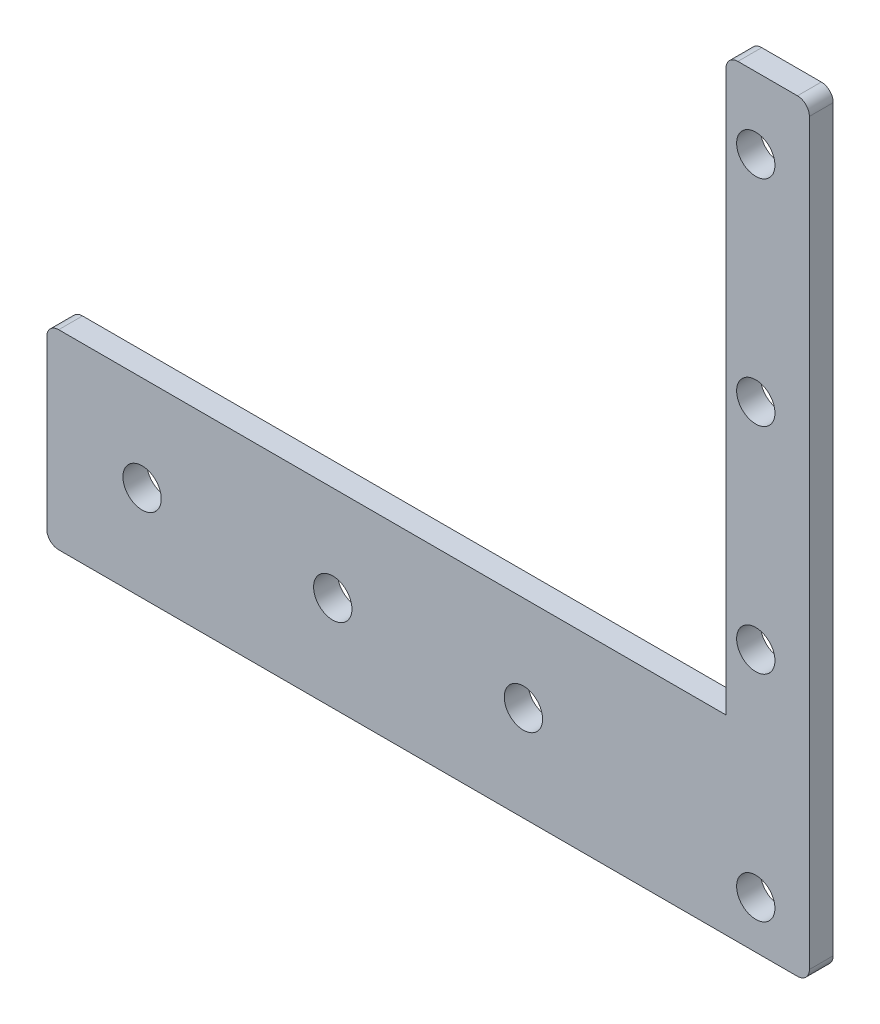
ISO-10303-21;
HEADER;
FILE_DESCRIPTION(('STEP AP214'),'2;1');
FILE_NAME('part.step','',(''),(''),'','','');
FILE_SCHEMA(('AUTOMOTIVE_DESIGN { 1 0 10303 214 1 1 1 1 }'));
ENDSEC;
DATA;
#1=APPLICATION_CONTEXT('core data for automotive mechanical design processes');
#2=APPLICATION_PROTOCOL_DEFINITION('international standard','automotive_design',2000,#1);
#3=PRODUCT_CONTEXT('',#1,'mechanical');
#4=PRODUCT('Part','Part','',(#3));
#5=PRODUCT_RELATED_PRODUCT_CATEGORY('part','',(#4));
#6=PRODUCT_DEFINITION_FORMATION('','',#4);
#7=PRODUCT_DEFINITION_CONTEXT('part definition',#1,'design');
#8=PRODUCT_DEFINITION('design','',#6,#7);
#9=PRODUCT_DEFINITION_SHAPE('','',#8);
#10=(LENGTH_UNIT() NAMED_UNIT(*) SI_UNIT(.MILLI.,.METRE.));
#11=(NAMED_UNIT(*) PLANE_ANGLE_UNIT() SI_UNIT($,.RADIAN.));
#12=(NAMED_UNIT(*) SI_UNIT($,.STERADIAN.) SOLID_ANGLE_UNIT());
#13=UNCERTAINTY_MEASURE_WITH_UNIT(LENGTH_MEASURE(1.E-05),#10,'distance_accuracy_value','');
#14=(GEOMETRIC_REPRESENTATION_CONTEXT(3) GLOBAL_UNCERTAINTY_ASSIGNED_CONTEXT((#13)) GLOBAL_UNIT_ASSIGNED_CONTEXT((#10,
#11,#12)) REPRESENTATION_CONTEXT('',''));
#15=CARTESIAN_POINT('',(0.,0.,0.));
#16=DIRECTION('',(0.,0.,1.));
#17=DIRECTION('',(1.,0.,0.));
#18=AXIS2_PLACEMENT_3D('',#15,#16,#17);
#19=CARTESIAN_POINT('',(-101.6,0.,3.175));
#20=DIRECTION('',(0.,1.,0.));
#21=DIRECTION('',(0.,0.,1.));
#22=AXIS2_PLACEMENT_3D('',#19,#20,#21);
#23=PLANE('',#22);
#24=DIRECTION('',(1.,0.,0.));
#25=VECTOR('',#24,1.);
#26=CARTESIAN_POINT('',(-101.6,0.,0.));
#27=LINE('',#26,#25);
#28=CARTESIAN_POINT('',(-100.0125,0.,0.));
#29=VERTEX_POINT('',#28);
#30=CARTESIAN_POINT('',(-1.58750000000001,0.,0.));
#31=VERTEX_POINT('',#30);
#32=EDGE_CURVE('E143',#29,#31,#27,.T.);
#33=ORIENTED_EDGE('',*,*,#32,.T.);
#34=DIRECTION('',(0.,0.,-1.));
#35=VECTOR('',#34,1.);
#36=CARTESIAN_POINT('',(-1.58750000000001,0.,3.175));
#37=LINE('',#36,#35);
#38=CARTESIAN_POINT('',(-1.58750000000001,0.,3.175));
#39=VERTEX_POINT('',#38);
#40=EDGE_CURVE('E191',#31,#39,#37,.F.);
#41=ORIENTED_EDGE('',*,*,#40,.T.);
#42=DIRECTION('',(1.,0.,0.));
#43=VECTOR('',#42,1.);
#44=CARTESIAN_POINT('',(-101.6,0.,3.175));
#45=LINE('',#44,#43);
#46=CARTESIAN_POINT('',(-100.0125,0.,3.175));
#47=VERTEX_POINT('',#46);
#48=EDGE_CURVE('E157',#47,#39,#45,.T.);
#49=ORIENTED_EDGE('',*,*,#48,.F.);
#50=DIRECTION('',(0.,0.,-1.));
#51=VECTOR('',#50,1.);
#52=CARTESIAN_POINT('',(-100.0125,0.,3.175));
#53=LINE('',#52,#51);
#54=EDGE_CURVE('E188',#47,#29,#53,.T.);
#55=ORIENTED_EDGE('',*,*,#54,.T.);
#56=EDGE_LOOP('',(#33,#41,#49,#55));
#57=FACE_BOUND('',#56,.T.);
#58=ADVANCED_FACE('F32',(#57),#23,.F.);
#59=CARTESIAN_POINT('',(0.,0.,3.175));
#60=DIRECTION('',(-1.,0.,0.));
#61=DIRECTION('',(0.,0.,1.));
#62=AXIS2_PLACEMENT_3D('',#59,#60,#61);
#63=PLANE('',#62);
#64=DIRECTION('',(0.,1.,0.));
#65=VECTOR('',#64,1.);
#66=CARTESIAN_POINT('',(0.,0.,0.));
#67=LINE('',#66,#65);
#68=CARTESIAN_POINT('',(0.,1.5875,0.));
#69=VERTEX_POINT('',#68);
#70=CARTESIAN_POINT('',(0.,100.0125,0.));
#71=VERTEX_POINT('',#70);
#72=EDGE_CURVE('E146',#69,#71,#67,.T.);
#73=ORIENTED_EDGE('',*,*,#72,.T.);
#74=DIRECTION('',(0.,0.,-1.));
#75=VECTOR('',#74,1.);
#76=CARTESIAN_POINT('',(0.,100.0125,3.175));
#77=LINE('',#76,#75);
#78=CARTESIAN_POINT('',(0.,100.0125,3.175));
#79=VERTEX_POINT('',#78);
#80=EDGE_CURVE('E186',#71,#79,#77,.F.);
#81=ORIENTED_EDGE('',*,*,#80,.T.);
#82=DIRECTION('',(0.,1.,0.));
#83=VECTOR('',#82,1.);
#84=CARTESIAN_POINT('',(0.,0.,3.175));
#85=LINE('',#84,#83);
#86=CARTESIAN_POINT('',(0.,1.5875,3.175));
#87=VERTEX_POINT('',#86);
#88=EDGE_CURVE('E211',#87,#79,#85,.T.);
#89=ORIENTED_EDGE('',*,*,#88,.F.);
#90=DIRECTION('',(0.,0.,-1.));
#91=VECTOR('',#90,1.);
#92=CARTESIAN_POINT('',(0.,1.5875,3.175));
#93=LINE('',#92,#91);
#94=EDGE_CURVE('E183',#87,#69,#93,.T.);
#95=ORIENTED_EDGE('',*,*,#94,.T.);
#96=EDGE_LOOP('',(#73,#81,#89,#95));
#97=FACE_BOUND('',#96,.T.);
#98=ADVANCED_FACE('F231',(#97),#63,.F.);
#99=CARTESIAN_POINT('',(0.,101.6,3.175));
#100=DIRECTION('',(0.,-1.,0.));
#101=DIRECTION('',(0.,0.,-1.));
#102=AXIS2_PLACEMENT_3D('',#99,#100,#101);
#103=PLANE('',#102);
#104=DIRECTION('',(-1.,0.,0.));
#105=VECTOR('',#104,1.);
#106=CARTESIAN_POINT('',(0.,101.6,0.));
#107=LINE('',#106,#105);
#108=CARTESIAN_POINT('',(-1.5875,101.6,0.));
#109=VERTEX_POINT('',#108);
#110=CARTESIAN_POINT('',(-9.525,101.6,0.));
#111=VERTEX_POINT('',#110);
#112=EDGE_CURVE('E150',#109,#111,#107,.T.);
#113=ORIENTED_EDGE('',*,*,#112,.T.);
#114=DIRECTION('',(0.,0.,-1.));
#115=VECTOR('',#114,1.);
#116=CARTESIAN_POINT('',(-9.525,101.6,3.175));
#117=LINE('',#116,#115);
#118=CARTESIAN_POINT('',(-9.525,101.6,3.175));
#119=VERTEX_POINT('',#118);
#120=EDGE_CURVE('E173',#111,#119,#117,.F.);
#121=ORIENTED_EDGE('',*,*,#120,.T.);
#122=DIRECTION('',(-1.,0.,0.));
#123=VECTOR('',#122,1.);
#124=CARTESIAN_POINT('',(0.,101.6,3.175));
#125=LINE('',#124,#123);
#126=CARTESIAN_POINT('',(-1.5875,101.6,3.175));
#127=VERTEX_POINT('',#126);
#128=EDGE_CURVE('E124',#127,#119,#125,.T.);
#129=ORIENTED_EDGE('',*,*,#128,.F.);
#130=DIRECTION('',(0.,0.,-1.));
#131=VECTOR('',#130,1.);
#132=CARTESIAN_POINT('',(-1.5875,101.6,3.175));
#133=LINE('',#132,#131);
#134=EDGE_CURVE('E170',#127,#109,#133,.T.);
#135=ORIENTED_EDGE('',*,*,#134,.T.);
#136=EDGE_LOOP('',(#113,#121,#129,#135));
#137=FACE_BOUND('',#136,.T.);
#138=ADVANCED_FACE('F236',(#137),#103,.F.);
#139=CARTESIAN_POINT('',(-11.1125,101.6,3.175));
#140=DIRECTION('',(1.,0.,0.));
#141=DIRECTION('',(0.,1.,0.));
#142=AXIS2_PLACEMENT_3D('',#139,#140,#141);
#143=PLANE('',#142);
#144=DIRECTION('',(0.,-1.,0.));
#145=VECTOR('',#144,1.);
#146=CARTESIAN_POINT('',(-11.1125,101.6,3.175));
#147=LINE('',#146,#145);
#148=CARTESIAN_POINT('',(-11.1125,100.0125,3.175));
#149=VERTEX_POINT('',#148);
#150=CARTESIAN_POINT('',(-11.1125,25.4,3.175));
#151=VERTEX_POINT('',#150);
#152=EDGE_CURVE('E113',#149,#151,#147,.T.);
#153=ORIENTED_EDGE('',*,*,#152,.F.);
#154=DIRECTION('',(0.,0.,-1.));
#155=VECTOR('',#154,1.);
#156=CARTESIAN_POINT('',(-11.1125,100.0125,3.175));
#157=LINE('',#156,#155);
#158=CARTESIAN_POINT('',(-11.1125,100.0125,0.));
#159=VERTEX_POINT('',#158);
#160=EDGE_CURVE('E134',#149,#159,#157,.T.);
#161=ORIENTED_EDGE('',*,*,#160,.T.);
#162=DIRECTION('',(0.,-1.,0.));
#163=VECTOR('',#162,1.);
#164=CARTESIAN_POINT('',(-11.1125,101.6,0.));
#165=LINE('',#164,#163);
#166=CARTESIAN_POINT('',(-11.1125,25.4,0.));
#167=VERTEX_POINT('',#166);
#168=EDGE_CURVE('E130',#159,#167,#165,.T.);
#169=ORIENTED_EDGE('',*,*,#168,.T.);
#170=DIRECTION('',(0.,0.,-1.));
#171=VECTOR('',#170,1.);
#172=CARTESIAN_POINT('',(-11.1125,25.4,3.175));
#173=LINE('',#172,#171);
#174=EDGE_CURVE('E127',#151,#167,#173,.T.);
#175=ORIENTED_EDGE('',*,*,#174,.F.);
#176=EDGE_LOOP('',(#153,#161,#169,#175));
#177=FACE_BOUND('',#176,.T.);
#178=ADVANCED_FACE('F128',(#177),#143,.F.);
#179=CARTESIAN_POINT('',(-11.1125,25.4,3.175));
#180=DIRECTION('',(0.,-1.,0.));
#181=DIRECTION('',(1.,0.,0.));
#182=AXIS2_PLACEMENT_3D('',#179,#180,#181);
#183=PLANE('',#182);
#184=DIRECTION('',(-1.,0.,0.));
#185=VECTOR('',#184,1.);
#186=CARTESIAN_POINT('',(-11.1125,25.4,0.));
#187=LINE('',#186,#185);
#188=CARTESIAN_POINT('',(-100.0125,25.4,0.));
#189=VERTEX_POINT('',#188);
#190=EDGE_CURVE('E154',#167,#189,#187,.T.);
#191=ORIENTED_EDGE('',*,*,#190,.T.);
#192=DIRECTION('',(0.,0.,-1.));
#193=VECTOR('',#192,1.);
#194=CARTESIAN_POINT('',(-100.0125,25.4,3.175));
#195=LINE('',#194,#193);
#196=CARTESIAN_POINT('',(-100.0125,25.4,3.175));
#197=VERTEX_POINT('',#196);
#198=EDGE_CURVE('E11',#189,#197,#195,.F.);
#199=ORIENTED_EDGE('',*,*,#198,.T.);
#200=DIRECTION('',(-1.,0.,0.));
#201=VECTOR('',#200,1.);
#202=CARTESIAN_POINT('',(-11.1125,25.4,3.175));
#203=LINE('',#202,#201);
#204=EDGE_CURVE('E118',#151,#197,#203,.T.);
#205=ORIENTED_EDGE('',*,*,#204,.F.);
#206=ORIENTED_EDGE('',*,*,#174,.T.);
#207=EDGE_LOOP('',(#191,#199,#205,#206));
#208=FACE_BOUND('',#207,.T.);
#209=ADVANCED_FACE('F137',(#208),#183,.F.);
#210=CARTESIAN_POINT('',(-101.6,25.4,3.175));
#211=DIRECTION('',(1.,0.,0.));
#212=DIRECTION('',(0.,0.,-1.));
#213=AXIS2_PLACEMENT_3D('',#210,#211,#212);
#214=PLANE('',#213);
#215=DIRECTION('',(0.,-1.,0.));
#216=VECTOR('',#215,1.);
#217=CARTESIAN_POINT('',(-101.6,25.4,0.));
#218=LINE('',#217,#216);
#219=CARTESIAN_POINT('',(-101.6,23.8125,0.));
#220=VERTEX_POINT('',#219);
#221=CARTESIAN_POINT('',(-101.6,1.5875,0.));
#222=VERTEX_POINT('',#221);
#223=EDGE_CURVE('E156',#220,#222,#218,.T.);
#224=ORIENTED_EDGE('',*,*,#223,.T.);
#225=DIRECTION('',(0.,0.,-1.));
#226=VECTOR('',#225,1.);
#227=CARTESIAN_POINT('',(-101.6,1.5875,3.175));
#228=LINE('',#227,#226);
#229=CARTESIAN_POINT('',(-101.6,1.5875,3.175));
#230=VERTEX_POINT('',#229);
#231=EDGE_CURVE('E40',#222,#230,#228,.F.);
#232=ORIENTED_EDGE('',*,*,#231,.T.);
#233=DIRECTION('',(0.,-1.,0.));
#234=VECTOR('',#233,1.);
#235=CARTESIAN_POINT('',(-101.6,25.4,3.175));
#236=LINE('',#235,#234);
#237=CARTESIAN_POINT('',(-101.6,23.8125,3.175));
#238=VERTEX_POINT('',#237);
#239=EDGE_CURVE('E135',#238,#230,#236,.T.);
#240=ORIENTED_EDGE('',*,*,#239,.F.);
#241=DIRECTION('',(0.,0.,-1.));
#242=VECTOR('',#241,1.);
#243=CARTESIAN_POINT('',(-101.6,23.8125,3.175));
#244=LINE('',#243,#242);
#245=EDGE_CURVE('E193',#238,#220,#244,.T.);
#246=ORIENTED_EDGE('',*,*,#245,.T.);
#247=EDGE_LOOP('',(#224,#232,#240,#246));
#248=FACE_BOUND('',#247,.T.);
#249=ADVANCED_FACE('F197',(#248),#214,.F.);
#250=CARTESIAN_POINT('',(0.,0.,3.175));
#251=DIRECTION('',(0.,0.,1.));
#252=DIRECTION('',(1.,0.,0.));
#253=AXIS2_PLACEMENT_3D('',#250,#251,#252);
#254=PLANE('',#253);
#255=CARTESIAN_POINT('',(-38.1,12.7,3.175));
#256=DIRECTION('',(0.,0.,1.));
#257=DIRECTION('',(1.,0.,0.));
#258=AXIS2_PLACEMENT_3D('',#255,#256,#257);
#259=CIRCLE('',#258,2.55269999999998);
#260=CARTESIAN_POINT('',(-35.5473,12.7,3.175));
#261=VERTEX_POINT('',#260);
#262=EDGE_CURVE('E306',#261,#261,#259,.T.);
#263=ORIENTED_EDGE('',*,*,#262,.F.);
#264=EDGE_LOOP('',(#263));
#265=FACE_BOUND('',#264,.T.);
#266=CARTESIAN_POINT('',(-63.5,12.7,3.175));
#267=DIRECTION('',(0.,0.,1.));
#268=DIRECTION('',(1.,0.,0.));
#269=AXIS2_PLACEMENT_3D('',#266,#267,#268);
#270=CIRCLE('',#269,2.55269999999999);
#271=CARTESIAN_POINT('',(-60.9473,12.7,3.175));
#272=VERTEX_POINT('',#271);
#273=EDGE_CURVE('E308',#272,#272,#270,.T.);
#274=ORIENTED_EDGE('',*,*,#273,.F.);
#275=EDGE_LOOP('',(#274));
#276=FACE_BOUND('',#275,.T.);
#277=CARTESIAN_POINT('',(-88.9,12.7,3.175));
#278=DIRECTION('',(0.,0.,1.));
#279=DIRECTION('',(1.,0.,0.));
#280=AXIS2_PLACEMENT_3D('',#277,#278,#279);
#281=CIRCLE('',#280,2.55269999999999);
#282=CARTESIAN_POINT('',(-86.3473,12.7,3.175));
#283=VERTEX_POINT('',#282);
#284=EDGE_CURVE('E316',#283,#283,#281,.T.);
#285=ORIENTED_EDGE('',*,*,#284,.F.);
#286=EDGE_LOOP('',(#285));
#287=FACE_BOUND('',#286,.T.);
#288=CARTESIAN_POINT('',(-7.14375000000665,6.34999999999979,3.175));
#289=DIRECTION('',(0.,0.,1.));
#290=DIRECTION('',(1.,0.,0.));
#291=AXIS2_PLACEMENT_3D('',#288,#289,#290);
#292=CIRCLE('',#291,2.55269999999999);
#293=CARTESIAN_POINT('',(-4.59105000000667,6.34999999999979,3.175));
#294=VERTEX_POINT('',#293);
#295=EDGE_CURVE('E322',#294,#294,#292,.T.);
#296=ORIENTED_EDGE('',*,*,#295,.F.);
#297=EDGE_LOOP('',(#296));
#298=FACE_BOUND('',#297,.T.);
#299=CARTESIAN_POINT('',(-7.14375000000657,34.9249999999998,3.175));
#300=DIRECTION('',(0.,0.,1.));
#301=DIRECTION('',(1.,0.,0.));
#302=AXIS2_PLACEMENT_3D('',#299,#300,#301);
#303=CIRCLE('',#302,2.55269999999999);
#304=CARTESIAN_POINT('',(-4.59105000000658,34.9249999999998,3.175));
#305=VERTEX_POINT('',#304);
#306=EDGE_CURVE('E328',#305,#305,#303,.T.);
#307=ORIENTED_EDGE('',*,*,#306,.F.);
#308=EDGE_LOOP('',(#307));
#309=FACE_BOUND('',#308,.T.);
#310=CARTESIAN_POINT('',(-7.14375000000657,63.4999999999998,3.175));
#311=DIRECTION('',(0.,0.,1.));
#312=DIRECTION('',(1.,0.,0.));
#313=AXIS2_PLACEMENT_3D('',#310,#311,#312);
#314=CIRCLE('',#313,2.55269999999999);
#315=CARTESIAN_POINT('',(-4.59105000000658,63.4999999999998,3.175));
#316=VERTEX_POINT('',#315);
#317=EDGE_CURVE('E334',#316,#316,#314,.T.);
#318=ORIENTED_EDGE('',*,*,#317,.F.);
#319=EDGE_LOOP('',(#318));
#320=FACE_BOUND('',#319,.T.);
#321=CARTESIAN_POINT('',(-7.14375000000657,92.0749999999998,3.175));
#322=DIRECTION('',(0.,0.,1.));
#323=DIRECTION('',(1.,0.,0.));
#324=AXIS2_PLACEMENT_3D('',#321,#322,#323);
#325=CIRCLE('',#324,2.55269999999999);
#326=CARTESIAN_POINT('',(-4.59105000000658,92.0749999999998,3.175));
#327=VERTEX_POINT('',#326);
#328=EDGE_CURVE('E339',#327,#327,#325,.T.);
#329=ORIENTED_EDGE('',*,*,#328,.F.);
#330=EDGE_LOOP('',(#329));
#331=FACE_BOUND('',#330,.T.);
#332=ORIENTED_EDGE('',*,*,#128,.T.);
#333=CARTESIAN_POINT('',(-9.525,100.0125,3.175));
#334=DIRECTION('',(0.,0.,1.));
#335=DIRECTION('',(1.,0.,0.));
#336=AXIS2_PLACEMENT_3D('',#333,#334,#335);
#337=CIRCLE('',#336,1.5875);
#338=EDGE_CURVE('E120',#119,#149,#337,.T.);
#339=ORIENTED_EDGE('',*,*,#338,.T.);
#340=ORIENTED_EDGE('',*,*,#152,.T.);
#341=ORIENTED_EDGE('',*,*,#204,.T.);
#342=CARTESIAN_POINT('',(-100.0125,23.8125,3.175));
#343=DIRECTION('',(0.,0.,1.));
#344=DIRECTION('',(1.,0.,0.));
#345=AXIS2_PLACEMENT_3D('',#342,#343,#344);
#346=CIRCLE('',#345,1.5875);
#347=EDGE_CURVE('E53',#197,#238,#346,.T.);
#348=ORIENTED_EDGE('',*,*,#347,.T.);
#349=ORIENTED_EDGE('',*,*,#239,.T.);
#350=CARTESIAN_POINT('',(-100.0125,1.5875,3.175));
#351=DIRECTION('',(0.,0.,1.));
#352=DIRECTION('',(1.,0.,0.));
#353=AXIS2_PLACEMENT_3D('',#350,#351,#352);
#354=CIRCLE('',#353,1.5875);
#355=EDGE_CURVE('E176',#230,#47,#354,.T.);
#356=ORIENTED_EDGE('',*,*,#355,.T.);
#357=ORIENTED_EDGE('',*,*,#48,.T.);
#358=CARTESIAN_POINT('',(-1.5875,1.5875,3.175));
#359=DIRECTION('',(0.,0.,1.));
#360=DIRECTION('',(1.,0.,0.));
#361=AXIS2_PLACEMENT_3D('',#358,#359,#360);
#362=CIRCLE('',#361,1.5875);
#363=EDGE_CURVE('E178',#39,#87,#362,.T.);
#364=ORIENTED_EDGE('',*,*,#363,.T.);
#365=ORIENTED_EDGE('',*,*,#88,.T.);
#366=CARTESIAN_POINT('',(-1.5875,100.0125,3.175));
#367=DIRECTION('',(0.,0.,1.));
#368=DIRECTION('',(1.,0.,0.));
#369=AXIS2_PLACEMENT_3D('',#366,#367,#368);
#370=CIRCLE('',#369,1.5875);
#371=EDGE_CURVE('E180',#79,#127,#370,.T.);
#372=ORIENTED_EDGE('',*,*,#371,.T.);
#373=EDGE_LOOP('',(#332,#339,#340,#341,#348,#349,#356,#357,#364,#365,#372));
#374=FACE_BOUND('',#373,.T.);
#375=ADVANCED_FACE('F116',(#265,#276,#287,#298,#309,#320,#331,#374),#254,.T.);
#376=CARTESIAN_POINT('',(0.,0.,0.));
#377=DIRECTION('',(0.,0.,1.));
#378=DIRECTION('',(1.,0.,0.));
#379=AXIS2_PLACEMENT_3D('',#376,#377,#378);
#380=PLANE('',#379);
#381=CARTESIAN_POINT('',(-38.1,12.7,0.));
#382=DIRECTION('',(0.,0.,1.));
#383=DIRECTION('',(1.,0.,0.));
#384=AXIS2_PLACEMENT_3D('',#381,#382,#383);
#385=CIRCLE('',#384,2.55269999999999);
#386=CARTESIAN_POINT('',(-35.5473,12.7,0.));
#387=VERTEX_POINT('',#386);
#388=EDGE_CURVE('E303',#387,#387,#385,.T.);
#389=ORIENTED_EDGE('',*,*,#388,.T.);
#390=EDGE_LOOP('',(#389));
#391=FACE_BOUND('',#390,.T.);
#392=CARTESIAN_POINT('',(-63.5,12.7,0.));
#393=DIRECTION('',(0.,0.,1.));
#394=DIRECTION('',(1.,0.,0.));
#395=AXIS2_PLACEMENT_3D('',#392,#393,#394);
#396=CIRCLE('',#395,2.55269999999999);
#397=CARTESIAN_POINT('',(-60.9473,12.7,0.));
#398=VERTEX_POINT('',#397);
#399=EDGE_CURVE('E313',#398,#398,#396,.T.);
#400=ORIENTED_EDGE('',*,*,#399,.T.);
#401=EDGE_LOOP('',(#400));
#402=FACE_BOUND('',#401,.T.);
#403=CARTESIAN_POINT('',(-88.9,12.7,0.));
#404=DIRECTION('',(0.,0.,1.));
#405=DIRECTION('',(1.,0.,0.));
#406=AXIS2_PLACEMENT_3D('',#403,#404,#405);
#407=CIRCLE('',#406,2.55269999999999);
#408=CARTESIAN_POINT('',(-86.3473,12.7,0.));
#409=VERTEX_POINT('',#408);
#410=EDGE_CURVE('E319',#409,#409,#407,.T.);
#411=ORIENTED_EDGE('',*,*,#410,.T.);
#412=EDGE_LOOP('',(#411));
#413=FACE_BOUND('',#412,.T.);
#414=CARTESIAN_POINT('',(-7.14375000000665,6.34999999999979,0.));
#415=DIRECTION('',(0.,0.,1.));
#416=DIRECTION('',(1.,0.,0.));
#417=AXIS2_PLACEMENT_3D('',#414,#415,#416);
#418=CIRCLE('',#417,2.55269999999999);
#419=CARTESIAN_POINT('',(-4.59105000000666,6.34999999999979,0.));
#420=VERTEX_POINT('',#419);
#421=EDGE_CURVE('E325',#420,#420,#418,.T.);
#422=ORIENTED_EDGE('',*,*,#421,.T.);
#423=EDGE_LOOP('',(#422));
#424=FACE_BOUND('',#423,.T.);
#425=CARTESIAN_POINT('',(-7.14375000000657,34.9249999999998,0.));
#426=DIRECTION('',(0.,0.,1.));
#427=DIRECTION('',(1.,0.,0.));
#428=AXIS2_PLACEMENT_3D('',#425,#426,#427);
#429=CIRCLE('',#428,2.55269999999999);
#430=CARTESIAN_POINT('',(-4.59105000000657,34.9249999999998,0.));
#431=VERTEX_POINT('',#430);
#432=EDGE_CURVE('E331',#431,#431,#429,.T.);
#433=ORIENTED_EDGE('',*,*,#432,.T.);
#434=EDGE_LOOP('',(#433));
#435=FACE_BOUND('',#434,.T.);
#436=CARTESIAN_POINT('',(-7.14375000000657,63.4999999999998,0.));
#437=DIRECTION('',(0.,0.,1.));
#438=DIRECTION('',(1.,0.,0.));
#439=AXIS2_PLACEMENT_3D('',#436,#437,#438);
#440=CIRCLE('',#439,2.55269999999999);
#441=CARTESIAN_POINT('',(-4.59105000000657,63.4999999999998,0.));
#442=VERTEX_POINT('',#441);
#443=EDGE_CURVE('E337',#442,#442,#440,.T.);
#444=ORIENTED_EDGE('',*,*,#443,.T.);
#445=EDGE_LOOP('',(#444));
#446=FACE_BOUND('',#445,.T.);
#447=CARTESIAN_POINT('',(-7.14375000000657,92.0749999999998,0.));
#448=DIRECTION('',(0.,0.,1.));
#449=DIRECTION('',(1.,0.,0.));
#450=AXIS2_PLACEMENT_3D('',#447,#448,#449);
#451=CIRCLE('',#450,2.55269999999999);
#452=CARTESIAN_POINT('',(-4.59105000000657,92.0749999999998,0.));
#453=VERTEX_POINT('',#452);
#454=EDGE_CURVE('E147',#453,#453,#451,.T.);
#455=ORIENTED_EDGE('',*,*,#454,.T.);
#456=EDGE_LOOP('',(#455));
#457=FACE_BOUND('',#456,.T.);
#458=ORIENTED_EDGE('',*,*,#168,.F.);
#459=CARTESIAN_POINT('',(-9.525,100.0125,0.));
#460=DIRECTION('',(0.,0.,1.));
#461=DIRECTION('',(1.,0.,0.));
#462=AXIS2_PLACEMENT_3D('',#459,#460,#461);
#463=CIRCLE('',#462,1.5875);
#464=EDGE_CURVE('E168',#159,#111,#463,.F.);
#465=ORIENTED_EDGE('',*,*,#464,.T.);
#466=ORIENTED_EDGE('',*,*,#112,.F.);
#467=CARTESIAN_POINT('',(-1.5875,100.0125,0.));
#468=DIRECTION('',(0.,0.,1.));
#469=DIRECTION('',(1.,0.,0.));
#470=AXIS2_PLACEMENT_3D('',#467,#468,#469);
#471=CIRCLE('',#470,1.5875);
#472=EDGE_CURVE('E166',#109,#71,#471,.F.);
#473=ORIENTED_EDGE('',*,*,#472,.T.);
#474=ORIENTED_EDGE('',*,*,#72,.F.);
#475=CARTESIAN_POINT('',(-1.5875,1.5875,0.));
#476=DIRECTION('',(0.,0.,1.));
#477=DIRECTION('',(1.,0.,0.));
#478=AXIS2_PLACEMENT_3D('',#475,#476,#477);
#479=CIRCLE('',#478,1.5875);
#480=EDGE_CURVE('E164',#69,#31,#479,.F.);
#481=ORIENTED_EDGE('',*,*,#480,.T.);
#482=ORIENTED_EDGE('',*,*,#32,.F.);
#483=CARTESIAN_POINT('',(-100.0125,1.5875,0.));
#484=DIRECTION('',(0.,0.,1.));
#485=DIRECTION('',(1.,0.,0.));
#486=AXIS2_PLACEMENT_3D('',#483,#484,#485);
#487=CIRCLE('',#486,1.5875);
#488=EDGE_CURVE('E162',#29,#222,#487,.F.);
#489=ORIENTED_EDGE('',*,*,#488,.T.);
#490=ORIENTED_EDGE('',*,*,#223,.F.);
#491=CARTESIAN_POINT('',(-100.0125,23.8125,0.));
#492=DIRECTION('',(0.,0.,1.));
#493=DIRECTION('',(1.,0.,0.));
#494=AXIS2_PLACEMENT_3D('',#491,#492,#493);
#495=CIRCLE('',#494,1.5875);
#496=EDGE_CURVE('E160',#220,#189,#495,.F.);
#497=ORIENTED_EDGE('',*,*,#496,.T.);
#498=ORIENTED_EDGE('',*,*,#190,.F.);
#499=EDGE_LOOP('',(#458,#465,#466,#473,#474,#481,#482,#489,#490,#497,#498));
#500=FACE_BOUND('',#499,.T.);
#501=ADVANCED_FACE('F200',(#391,#402,#413,#424,#435,#446,#457,#500),#380,.F.);
#502=CARTESIAN_POINT('',(-7.14375000000657,92.0749999999998,3.175));
#503=DIRECTION('',(0.,0.,1.));
#504=DIRECTION('',(1.,0.,0.));
#505=AXIS2_PLACEMENT_3D('',#502,#503,#504);
#506=CYLINDRICAL_SURFACE('',#505,2.55269999999999);
#507=ORIENTED_EDGE('',*,*,#454,.F.);
#508=EDGE_LOOP('',(#507));
#509=FACE_BOUND('',#508,.T.);
#510=ORIENTED_EDGE('',*,*,#328,.T.);
#511=EDGE_LOOP('',(#510));
#512=FACE_BOUND('',#511,.T.);
#513=ADVANCED_FACE('F268',(#509,#512),#506,.F.);
#514=CARTESIAN_POINT('',(-7.14375000000657,63.4999999999998,3.175));
#515=DIRECTION('',(0.,0.,1.));
#516=DIRECTION('',(1.,0.,0.));
#517=AXIS2_PLACEMENT_3D('',#514,#515,#516);
#518=CYLINDRICAL_SURFACE('',#517,2.55269999999999);
#519=ORIENTED_EDGE('',*,*,#443,.F.);
#520=EDGE_LOOP('',(#519));
#521=FACE_BOUND('',#520,.T.);
#522=ORIENTED_EDGE('',*,*,#317,.T.);
#523=EDGE_LOOP('',(#522));
#524=FACE_BOUND('',#523,.T.);
#525=ADVANCED_FACE('F275',(#521,#524),#518,.F.);
#526=CARTESIAN_POINT('',(-7.14375000000657,34.9249999999998,3.175));
#527=DIRECTION('',(0.,0.,1.));
#528=DIRECTION('',(1.,0.,0.));
#529=AXIS2_PLACEMENT_3D('',#526,#527,#528);
#530=CYLINDRICAL_SURFACE('',#529,2.55269999999999);
#531=ORIENTED_EDGE('',*,*,#432,.F.);
#532=EDGE_LOOP('',(#531));
#533=FACE_BOUND('',#532,.T.);
#534=ORIENTED_EDGE('',*,*,#306,.T.);
#535=EDGE_LOOP('',(#534));
#536=FACE_BOUND('',#535,.T.);
#537=ADVANCED_FACE('F279',(#533,#536),#530,.F.);
#538=CARTESIAN_POINT('',(-7.14375000000665,6.34999999999979,3.175));
#539=DIRECTION('',(0.,0.,1.));
#540=DIRECTION('',(1.,0.,0.));
#541=AXIS2_PLACEMENT_3D('',#538,#539,#540);
#542=CYLINDRICAL_SURFACE('',#541,2.55269999999999);
#543=ORIENTED_EDGE('',*,*,#421,.F.);
#544=EDGE_LOOP('',(#543));
#545=FACE_BOUND('',#544,.T.);
#546=ORIENTED_EDGE('',*,*,#295,.T.);
#547=EDGE_LOOP('',(#546));
#548=FACE_BOUND('',#547,.T.);
#549=ADVANCED_FACE('F283',(#545,#548),#542,.F.);
#550=CARTESIAN_POINT('',(-88.9,12.7,3.175));
#551=DIRECTION('',(0.,0.,1.));
#552=DIRECTION('',(1.,0.,0.));
#553=AXIS2_PLACEMENT_3D('',#550,#551,#552);
#554=CYLINDRICAL_SURFACE('',#553,2.55269999999999);
#555=ORIENTED_EDGE('',*,*,#410,.F.);
#556=EDGE_LOOP('',(#555));
#557=FACE_BOUND('',#556,.T.);
#558=ORIENTED_EDGE('',*,*,#284,.T.);
#559=EDGE_LOOP('',(#558));
#560=FACE_BOUND('',#559,.T.);
#561=ADVANCED_FACE('F287',(#557,#560),#554,.F.);
#562=CARTESIAN_POINT('',(-63.5,12.7,3.175));
#563=DIRECTION('',(0.,0.,1.));
#564=DIRECTION('',(1.,0.,0.));
#565=AXIS2_PLACEMENT_3D('',#562,#563,#564);
#566=CYLINDRICAL_SURFACE('',#565,2.55269999999999);
#567=ORIENTED_EDGE('',*,*,#399,.F.);
#568=EDGE_LOOP('',(#567));
#569=FACE_BOUND('',#568,.T.);
#570=ORIENTED_EDGE('',*,*,#273,.T.);
#571=EDGE_LOOP('',(#570));
#572=FACE_BOUND('',#571,.T.);
#573=ADVANCED_FACE('F291',(#569,#572),#566,.F.);
#574=CARTESIAN_POINT('',(-38.1,12.7,3.175));
#575=DIRECTION('',(0.,0.,1.));
#576=DIRECTION('',(1.,0.,0.));
#577=AXIS2_PLACEMENT_3D('',#574,#575,#576);
#578=CYLINDRICAL_SURFACE('',#577,2.55269999999999);
#579=ORIENTED_EDGE('',*,*,#388,.F.);
#580=EDGE_LOOP('',(#579));
#581=FACE_BOUND('',#580,.T.);
#582=ORIENTED_EDGE('',*,*,#262,.T.);
#583=EDGE_LOOP('',(#582));
#584=FACE_BOUND('',#583,.T.);
#585=ADVANCED_FACE('F244',(#581,#584),#578,.F.);
#586=CARTESIAN_POINT('',(-9.525,100.0125,3.175));
#587=DIRECTION('',(0.,0.,-1.));
#588=DIRECTION('',(-1.,0.,0.));
#589=AXIS2_PLACEMENT_3D('',#586,#587,#588);
#590=CYLINDRICAL_SURFACE('',#589,1.5875);
#591=ORIENTED_EDGE('',*,*,#338,.F.);
#592=ORIENTED_EDGE('',*,*,#120,.F.);
#593=ORIENTED_EDGE('',*,*,#464,.F.);
#594=ORIENTED_EDGE('',*,*,#160,.F.);
#595=EDGE_LOOP('',(#591,#592,#593,#594));
#596=FACE_BOUND('',#595,.T.);
#597=ADVANCED_FACE('F223',(#596),#590,.T.);
#598=CARTESIAN_POINT('',(-1.5875,100.0125,3.175));
#599=DIRECTION('',(0.,0.,-1.));
#600=DIRECTION('',(-1.,0.,0.));
#601=AXIS2_PLACEMENT_3D('',#598,#599,#600);
#602=CYLINDRICAL_SURFACE('',#601,1.5875);
#603=ORIENTED_EDGE('',*,*,#371,.F.);
#604=ORIENTED_EDGE('',*,*,#80,.F.);
#605=ORIENTED_EDGE('',*,*,#472,.F.);
#606=ORIENTED_EDGE('',*,*,#134,.F.);
#607=EDGE_LOOP('',(#603,#604,#605,#606));
#608=FACE_BOUND('',#607,.T.);
#609=ADVANCED_FACE('F243',(#608),#602,.T.);
#610=CARTESIAN_POINT('',(-1.5875,1.5875,3.175));
#611=DIRECTION('',(0.,0.,-1.));
#612=DIRECTION('',(-1.,0.,0.));
#613=AXIS2_PLACEMENT_3D('',#610,#611,#612);
#614=CYLINDRICAL_SURFACE('',#613,1.5875);
#615=ORIENTED_EDGE('',*,*,#363,.F.);
#616=ORIENTED_EDGE('',*,*,#40,.F.);
#617=ORIENTED_EDGE('',*,*,#480,.F.);
#618=ORIENTED_EDGE('',*,*,#94,.F.);
#619=EDGE_LOOP('',(#615,#616,#617,#618));
#620=FACE_BOUND('',#619,.T.);
#621=ADVANCED_FACE('F229',(#620),#614,.T.);
#622=CARTESIAN_POINT('',(-100.0125,1.5875,3.175));
#623=DIRECTION('',(0.,0.,-1.));
#624=DIRECTION('',(-1.,0.,0.));
#625=AXIS2_PLACEMENT_3D('',#622,#623,#624);
#626=CYLINDRICAL_SURFACE('',#625,1.5875);
#627=ORIENTED_EDGE('',*,*,#355,.F.);
#628=ORIENTED_EDGE('',*,*,#231,.F.);
#629=ORIENTED_EDGE('',*,*,#488,.F.);
#630=ORIENTED_EDGE('',*,*,#54,.F.);
#631=EDGE_LOOP('',(#627,#628,#629,#630));
#632=FACE_BOUND('',#631,.T.);
#633=ADVANCED_FACE('F205',(#632),#626,.T.);
#634=CARTESIAN_POINT('',(-100.0125,23.8125,3.175));
#635=DIRECTION('',(0.,0.,-1.));
#636=DIRECTION('',(-1.,0.,0.));
#637=AXIS2_PLACEMENT_3D('',#634,#635,#636);
#638=CYLINDRICAL_SURFACE('',#637,1.5875);
#639=ORIENTED_EDGE('',*,*,#347,.F.);
#640=ORIENTED_EDGE('',*,*,#198,.F.);
#641=ORIENTED_EDGE('',*,*,#496,.F.);
#642=ORIENTED_EDGE('',*,*,#245,.F.);
#643=EDGE_LOOP('',(#639,#640,#641,#642));
#644=FACE_BOUND('',#643,.T.);
#645=ADVANCED_FACE('F34',(#644),#638,.T.);
#646=CLOSED_SHELL('',(#58,#98,#138,#178,#209,#249,#375,#501,#513,#525,#537,#549,#561,#573,#585,
#597,#609,#621,#633,#645));
#647=MANIFOLD_SOLID_BREP('B2',#646);
#648=ADVANCED_BREP_SHAPE_REPRESENTATION('',(#18,#647),#14);
#649=SHAPE_DEFINITION_REPRESENTATION(#9,#648);
ENDSEC;
END-ISO-10303-21;
